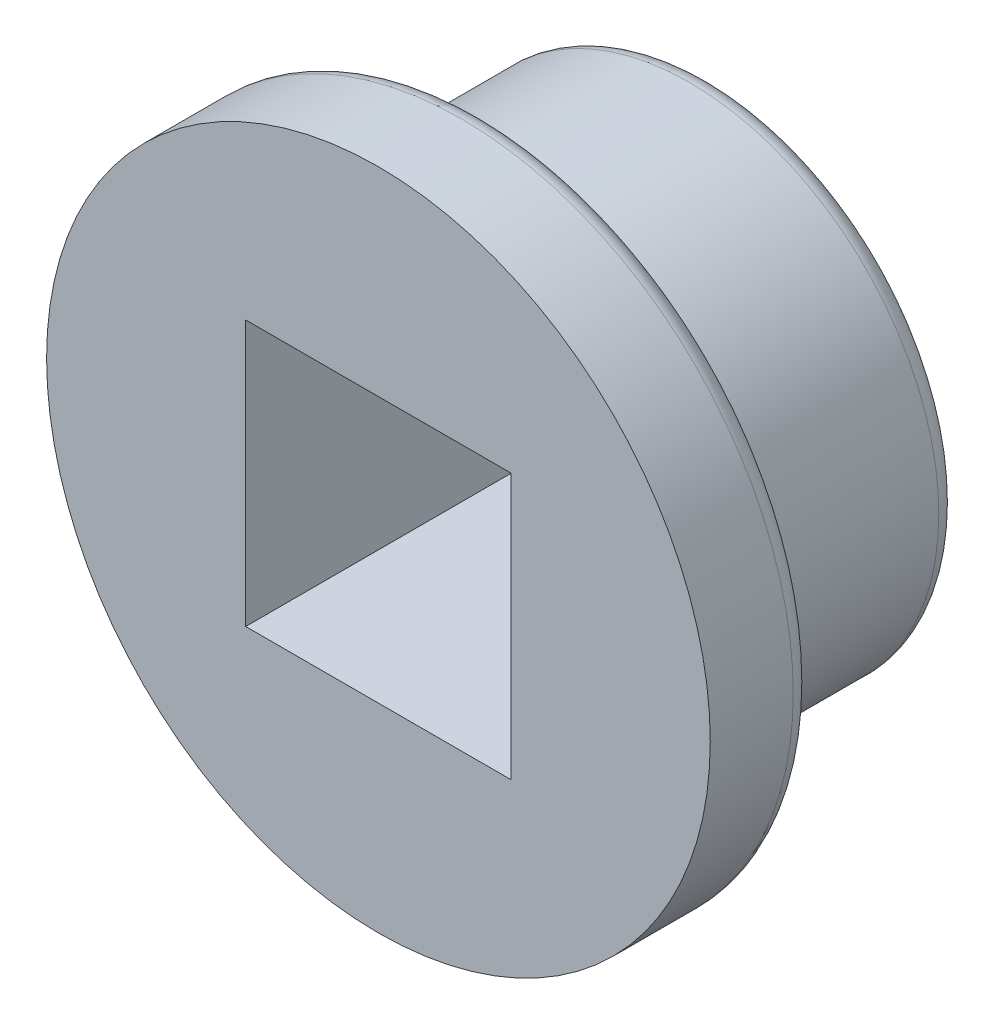
ISO-10303-21;
HEADER;
FILE_DESCRIPTION(('STEP AP214'),'2;1');
FILE_NAME('part.step','',(''),(''),'','','');
FILE_SCHEMA(('AUTOMOTIVE_DESIGN { 1 0 10303 214 1 1 1 1 }'));
ENDSEC;
DATA;
#1=APPLICATION_CONTEXT('core data for automotive mechanical design processes');
#2=APPLICATION_PROTOCOL_DEFINITION('international standard','automotive_design',2000,#1);
#3=PRODUCT_CONTEXT('',#1,'mechanical');
#4=PRODUCT('Part','Part','',(#3));
#5=PRODUCT_RELATED_PRODUCT_CATEGORY('part','',(#4));
#6=PRODUCT_DEFINITION_FORMATION('','',#4);
#7=PRODUCT_DEFINITION_CONTEXT('part definition',#1,'design');
#8=PRODUCT_DEFINITION('design','',#6,#7);
#9=PRODUCT_DEFINITION_SHAPE('','',#8);
#10=(LENGTH_UNIT() NAMED_UNIT(*) SI_UNIT(.MILLI.,.METRE.));
#11=(NAMED_UNIT(*) PLANE_ANGLE_UNIT() SI_UNIT($,.RADIAN.));
#12=(NAMED_UNIT(*) SI_UNIT($,.STERADIAN.) SOLID_ANGLE_UNIT());
#13=UNCERTAINTY_MEASURE_WITH_UNIT(LENGTH_MEASURE(1.E-05),#10,'distance_accuracy_value','');
#14=(GEOMETRIC_REPRESENTATION_CONTEXT(3) GLOBAL_UNCERTAINTY_ASSIGNED_CONTEXT((#13)) GLOBAL_UNIT_ASSIGNED_CONTEXT((#10,
#11,#12)) REPRESENTATION_CONTEXT('',''));
#15=CARTESIAN_POINT('',(0.,0.,0.));
#16=DIRECTION('',(0.,0.,1.));
#17=DIRECTION('',(1.,0.,0.));
#18=AXIS2_PLACEMENT_3D('',#15,#16,#17);
#19=CARTESIAN_POINT('',(0.,3.2,-5.5));
#20=DIRECTION('',(0.,-1.,0.));
#21=DIRECTION('',(0.,0.,-1.));
#22=AXIS2_PLACEMENT_3D('',#19,#20,#21);
#23=PLANE('',#22);
#24=DIRECTION('',(0.,0.,1.));
#25=VECTOR('',#24,1.);
#26=CARTESIAN_POINT('',(3.2,3.2,-5.5));
#27=LINE('',#26,#25);
#28=CARTESIAN_POINT('',(3.2,3.2,-5.5));
#29=VERTEX_POINT('',#28);
#30=CARTESIAN_POINT('',(3.2,3.2,2.5));
#31=VERTEX_POINT('',#30);
#32=EDGE_CURVE('E77',#29,#31,#27,.T.);
#33=ORIENTED_EDGE('',*,*,#32,.T.);
#34=DIRECTION('',(1.,0.,0.));
#35=VECTOR('',#34,1.);
#36=CARTESIAN_POINT('',(0.,3.2,2.5));
#37=LINE('',#36,#35);
#38=CARTESIAN_POINT('',(-3.2,3.2,2.5));
#39=VERTEX_POINT('',#38);
#40=EDGE_CURVE('E80',#39,#31,#37,.T.);
#41=ORIENTED_EDGE('',*,*,#40,.F.);
#42=DIRECTION('',(0.,0.,1.));
#43=VECTOR('',#42,1.);
#44=CARTESIAN_POINT('',(-3.2,3.2,-5.5));
#45=LINE('',#44,#43);
#46=CARTESIAN_POINT('',(-3.2,3.2,-5.5));
#47=VERTEX_POINT('',#46);
#48=EDGE_CURVE('E53',#47,#39,#45,.T.);
#49=ORIENTED_EDGE('',*,*,#48,.F.);
#50=DIRECTION('',(1.,0.,0.));
#51=VECTOR('',#50,1.);
#52=CARTESIAN_POINT('',(0.,3.2,-5.5));
#53=LINE('',#52,#51);
#54=EDGE_CURVE('E82',#47,#29,#53,.T.);
#55=ORIENTED_EDGE('',*,*,#54,.T.);
#56=EDGE_LOOP('',(#33,#41,#49,#55));
#57=FACE_BOUND('',#56,.T.);
#58=ADVANCED_FACE('F38',(#57),#23,.T.);
#59=CARTESIAN_POINT('',(-3.2,0.,-5.5));
#60=DIRECTION('',(-1.,0.,0.));
#61=DIRECTION('',(0.,0.,1.));
#62=AXIS2_PLACEMENT_3D('',#59,#60,#61);
#63=PLANE('',#62);
#64=ORIENTED_EDGE('',*,*,#48,.T.);
#65=DIRECTION('',(0.,-1.,0.));
#66=VECTOR('',#65,1.);
#67=CARTESIAN_POINT('',(-3.2,0.,2.5));
#68=LINE('',#67,#66);
#69=CARTESIAN_POINT('',(-3.2,-3.2,2.5));
#70=VERTEX_POINT('',#69);
#71=EDGE_CURVE('E99',#39,#70,#68,.T.);
#72=ORIENTED_EDGE('',*,*,#71,.T.);
#73=DIRECTION('',(0.,0.,1.));
#74=VECTOR('',#73,1.);
#75=CARTESIAN_POINT('',(-3.2,-3.2,-5.5));
#76=LINE('',#75,#74);
#77=CARTESIAN_POINT('',(-3.2,-3.2,-5.5));
#78=VERTEX_POINT('',#77);
#79=EDGE_CURVE('E118',#78,#70,#76,.T.);
#80=ORIENTED_EDGE('',*,*,#79,.F.);
#81=DIRECTION('',(0.,-1.,0.));
#82=VECTOR('',#81,1.);
#83=CARTESIAN_POINT('',(-3.2,0.,-5.5));
#84=LINE('',#83,#82);
#85=EDGE_CURVE('E60',#47,#78,#84,.T.);
#86=ORIENTED_EDGE('',*,*,#85,.F.);
#87=EDGE_LOOP('',(#64,#72,#80,#86));
#88=FACE_BOUND('',#87,.T.);
#89=ADVANCED_FACE('F141',(#88),#63,.F.);
#90=CARTESIAN_POINT('',(0.,-3.2,-5.5));
#91=DIRECTION('',(0.,-1.,0.));
#92=DIRECTION('',(0.,0.,-1.));
#93=AXIS2_PLACEMENT_3D('',#90,#91,#92);
#94=PLANE('',#93);
#95=ORIENTED_EDGE('',*,*,#79,.T.);
#96=DIRECTION('',(1.,0.,0.));
#97=VECTOR('',#96,1.);
#98=CARTESIAN_POINT('',(0.,-3.2,2.5));
#99=LINE('',#98,#97);
#100=CARTESIAN_POINT('',(3.2,-3.2,2.5));
#101=VERTEX_POINT('',#100);
#102=EDGE_CURVE('E95',#70,#101,#99,.T.);
#103=ORIENTED_EDGE('',*,*,#102,.T.);
#104=DIRECTION('',(0.,0.,1.));
#105=VECTOR('',#104,1.);
#106=CARTESIAN_POINT('',(3.2,-3.2,-5.5));
#107=LINE('',#106,#105);
#108=CARTESIAN_POINT('',(3.2,-3.2,-5.5));
#109=VERTEX_POINT('',#108);
#110=EDGE_CURVE('E86',#109,#101,#107,.T.);
#111=ORIENTED_EDGE('',*,*,#110,.F.);
#112=DIRECTION('',(1.,0.,0.));
#113=VECTOR('',#112,1.);
#114=CARTESIAN_POINT('',(0.,-3.2,-5.5));
#115=LINE('',#114,#113);
#116=EDGE_CURVE('E111',#78,#109,#115,.T.);
#117=ORIENTED_EDGE('',*,*,#116,.F.);
#118=EDGE_LOOP('',(#95,#103,#111,#117));
#119=FACE_BOUND('',#118,.T.);
#120=ADVANCED_FACE('F146',(#119),#94,.F.);
#121=CARTESIAN_POINT('',(3.2,0.,-5.5));
#122=DIRECTION('',(-1.,0.,0.));
#123=DIRECTION('',(0.,0.,1.));
#124=AXIS2_PLACEMENT_3D('',#121,#122,#123);
#125=PLANE('',#124);
#126=ORIENTED_EDGE('',*,*,#110,.T.);
#127=DIRECTION('',(0.,-1.,0.));
#128=VECTOR('',#127,1.);
#129=CARTESIAN_POINT('',(3.2,0.,2.5));
#130=LINE('',#129,#128);
#131=EDGE_CURVE('E89',#31,#101,#130,.T.);
#132=ORIENTED_EDGE('',*,*,#131,.F.);
#133=ORIENTED_EDGE('',*,*,#32,.F.);
#134=DIRECTION('',(0.,-1.,0.));
#135=VECTOR('',#134,1.);
#136=CARTESIAN_POINT('',(3.2,0.,-5.5));
#137=LINE('',#136,#135);
#138=EDGE_CURVE('E109',#29,#109,#137,.T.);
#139=ORIENTED_EDGE('',*,*,#138,.T.);
#140=EDGE_LOOP('',(#126,#132,#133,#139));
#141=FACE_BOUND('',#140,.T.);
#142=ADVANCED_FACE('F90',(#141),#125,.T.);
#143=CARTESIAN_POINT('',(0.,0.,-5.5));
#144=DIRECTION('',(0.,0.,1.));
#145=DIRECTION('',(1.,0.,0.));
#146=AXIS2_PLACEMENT_3D('',#143,#144,#145);
#147=CYLINDRICAL_SURFACE('',#146,6.01);
#148=CARTESIAN_POINT('',(0.,0.,-5.));
#149=DIRECTION('',(0.,0.,1.));
#150=DIRECTION('',(1.,0.,0.));
#151=AXIS2_PLACEMENT_3D('',#148,#149,#150);
#152=CIRCLE('',#151,6.01);
#153=CARTESIAN_POINT('',(6.01,0.,-5.));
#154=VERTEX_POINT('',#153);
#155=EDGE_CURVE('E46',#154,#154,#152,.T.);
#156=ORIENTED_EDGE('',*,*,#155,.T.);
#157=EDGE_LOOP('',(#156));
#158=FACE_BOUND('',#157,.T.);
#159=CARTESIAN_POINT('',(0.,0.,0.));
#160=DIRECTION('',(0.,0.,1.));
#161=DIRECTION('',(1.,0.,0.));
#162=AXIS2_PLACEMENT_3D('',#159,#160,#161);
#163=CIRCLE('',#162,6.01);
#164=CARTESIAN_POINT('',(6.01,0.,0.));
#165=VERTEX_POINT('',#164);
#166=EDGE_CURVE('E107',#165,#165,#163,.T.);
#167=ORIENTED_EDGE('',*,*,#166,.F.);
#168=EDGE_LOOP('',(#167));
#169=FACE_BOUND('',#168,.T.);
#170=ADVANCED_FACE('F128',(#158,#169),#147,.T.);
#171=CARTESIAN_POINT('',(0.,0.,-5.5));
#172=DIRECTION('',(0.,0.,1.));
#173=DIRECTION('',(1.,0.,0.));
#174=AXIS2_PLACEMENT_3D('',#171,#172,#173);
#175=PLANE('',#174);
#176=CARTESIAN_POINT('',(0.,0.,-5.5));
#177=DIRECTION('',(0.,0.,1.));
#178=DIRECTION('',(1.,0.,0.));
#179=AXIS2_PLACEMENT_3D('',#176,#177,#178);
#180=CIRCLE('',#179,5.51);
#181=CARTESIAN_POINT('',(5.51,0.,-5.5));
#182=VERTEX_POINT('',#181);
#183=EDGE_CURVE('E11',#182,#182,#180,.F.);
#184=ORIENTED_EDGE('',*,*,#183,.T.);
#185=EDGE_LOOP('',(#184));
#186=FACE_BOUND('',#185,.T.);
#187=ORIENTED_EDGE('',*,*,#54,.F.);
#188=ORIENTED_EDGE('',*,*,#85,.T.);
#189=ORIENTED_EDGE('',*,*,#116,.T.);
#190=ORIENTED_EDGE('',*,*,#138,.F.);
#191=EDGE_LOOP('',(#187,#188,#189,#190));
#192=FACE_BOUND('',#191,.T.);
#193=ADVANCED_FACE('F157',(#186,#192),#175,.F.);
#194=CARTESIAN_POINT('',(0.,0.,2.5));
#195=DIRECTION('',(0.,0.,-1.));
#196=DIRECTION('',(-1.,0.,0.));
#197=AXIS2_PLACEMENT_3D('',#194,#195,#196);
#198=CYLINDRICAL_SURFACE('',#197,8.);
#199=CARTESIAN_POINT('',(0.,0.,0.5));
#200=DIRECTION('',(0.,0.,1.));
#201=DIRECTION('',(1.,0.,0.));
#202=AXIS2_PLACEMENT_3D('',#199,#200,#201);
#203=CIRCLE('',#202,8.);
#204=CARTESIAN_POINT('',(8.,0.,0.5));
#205=VERTEX_POINT('',#204);
#206=EDGE_CURVE('E117',#205,#205,#203,.T.);
#207=ORIENTED_EDGE('',*,*,#206,.T.);
#208=EDGE_LOOP('',(#207));
#209=FACE_BOUND('',#208,.T.);
#210=CARTESIAN_POINT('',(0.,0.,2.5));
#211=DIRECTION('',(0.,0.,1.));
#212=DIRECTION('',(1.,0.,0.));
#213=AXIS2_PLACEMENT_3D('',#210,#211,#212);
#214=CIRCLE('',#213,8.);
#215=CARTESIAN_POINT('',(8.,0.,2.5));
#216=VERTEX_POINT('',#215);
#217=EDGE_CURVE('E100',#216,#216,#214,.T.);
#218=ORIENTED_EDGE('',*,*,#217,.F.);
#219=EDGE_LOOP('',(#218));
#220=FACE_BOUND('',#219,.T.);
#221=ADVANCED_FACE('F160',(#209,#220),#198,.T.);
#222=CARTESIAN_POINT('',(0.,0.,2.5));
#223=DIRECTION('',(0.,0.,1.));
#224=DIRECTION('',(1.,0.,0.));
#225=AXIS2_PLACEMENT_3D('',#222,#223,#224);
#226=PLANE('',#225);
#227=ORIENTED_EDGE('',*,*,#217,.T.);
#228=EDGE_LOOP('',(#227));
#229=FACE_BOUND('',#228,.T.);
#230=ORIENTED_EDGE('',*,*,#40,.T.);
#231=ORIENTED_EDGE('',*,*,#131,.T.);
#232=ORIENTED_EDGE('',*,*,#102,.F.);
#233=ORIENTED_EDGE('',*,*,#71,.F.);
#234=EDGE_LOOP('',(#230,#231,#232,#233));
#235=FACE_BOUND('',#234,.T.);
#236=ADVANCED_FACE('F97',(#229,#235),#226,.T.);
#237=CARTESIAN_POINT('',(0.,0.,0.));
#238=DIRECTION('',(0.,0.,1.));
#239=DIRECTION('',(1.,0.,0.));
#240=AXIS2_PLACEMENT_3D('',#237,#238,#239);
#241=PLANE('',#240);
#242=CARTESIAN_POINT('',(0.,0.,0.));
#243=DIRECTION('',(0.,0.,1.));
#244=DIRECTION('',(1.,0.,0.));
#245=AXIS2_PLACEMENT_3D('',#242,#243,#244);
#246=CIRCLE('',#245,7.5);
#247=CARTESIAN_POINT('',(7.5,0.,0.));
#248=VERTEX_POINT('',#247);
#249=EDGE_CURVE('E123',#248,#248,#246,.F.);
#250=ORIENTED_EDGE('',*,*,#249,.T.);
#251=EDGE_LOOP('',(#250));
#252=FACE_BOUND('',#251,.T.);
#253=ORIENTED_EDGE('',*,*,#166,.T.);
#254=EDGE_LOOP('',(#253));
#255=FACE_BOUND('',#254,.T.);
#256=ADVANCED_FACE('F137',(#252,#255),#241,.F.);
#257=CARTESIAN_POINT('',(0.,0.,0.5));
#258=DIRECTION('',(0.,0.,1.));
#259=DIRECTION('',(1.,0.,0.));
#260=AXIS2_PLACEMENT_3D('',#257,#258,#259);
#261=TOROIDAL_SURFACE('',#260,7.5,0.5);
#262=ORIENTED_EDGE('',*,*,#249,.F.);
#263=EDGE_LOOP('',(#262));
#264=FACE_BOUND('',#263,.T.);
#265=ORIENTED_EDGE('',*,*,#206,.F.);
#266=EDGE_LOOP('',(#265));
#267=FACE_BOUND('',#266,.T.);
#268=ADVANCED_FACE('F132',(#264,#267),#261,.T.);
#269=CARTESIAN_POINT('',(0.,0.,-5.));
#270=DIRECTION('',(0.,0.,1.));
#271=DIRECTION('',(1.,0.,0.));
#272=AXIS2_PLACEMENT_3D('',#269,#270,#271);
#273=TOROIDAL_SURFACE('',#272,5.51,0.5);
#274=ORIENTED_EDGE('',*,*,#183,.F.);
#275=EDGE_LOOP('',(#274));
#276=FACE_BOUND('',#275,.T.);
#277=ORIENTED_EDGE('',*,*,#155,.F.);
#278=EDGE_LOOP('',(#277));
#279=FACE_BOUND('',#278,.T.);
#280=ADVANCED_FACE('F40',(#276,#279),#273,.T.);
#281=CLOSED_SHELL('',(#58,#89,#120,#142,#170,#193,#221,#236,#256,#268,#280));
#282=MANIFOLD_SOLID_BREP('B2',#281);
#283=ADVANCED_BREP_SHAPE_REPRESENTATION('',(#18,#282),#14);
#284=SHAPE_DEFINITION_REPRESENTATION(#9,#283);
ENDSEC;
END-ISO-10303-21;
